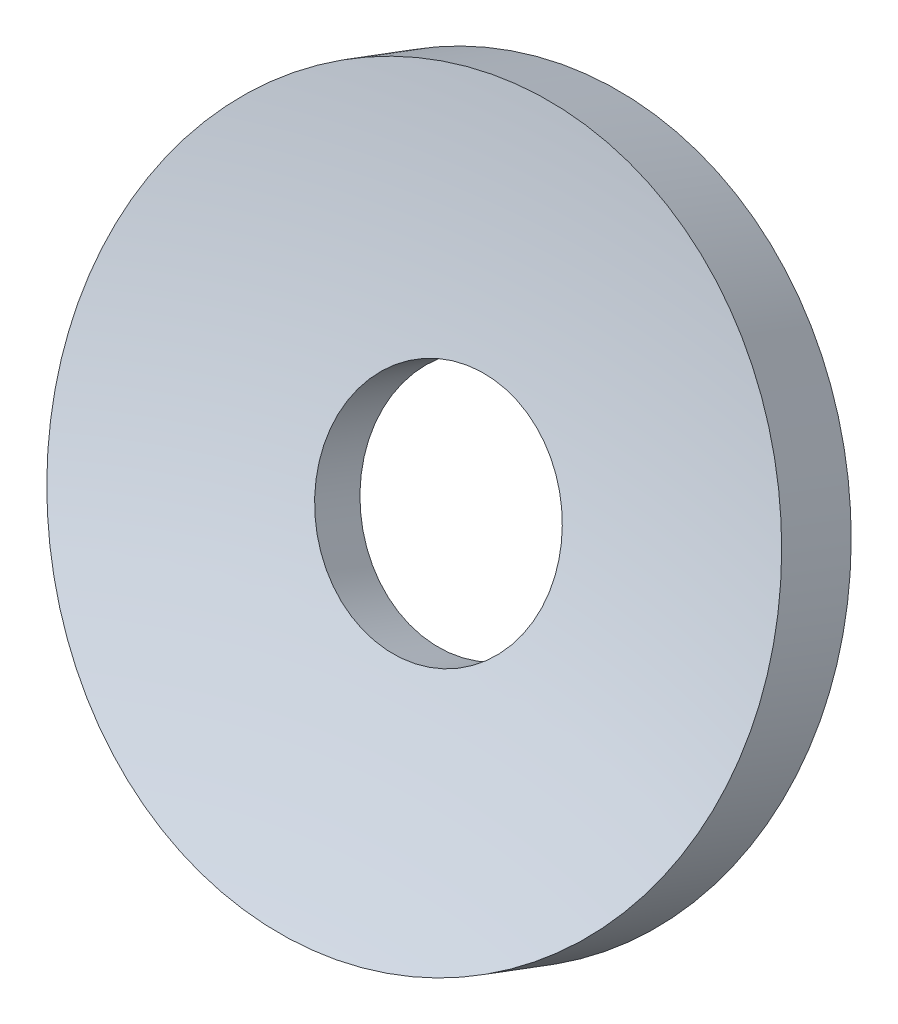
ISO-10303-21;
HEADER;
FILE_DESCRIPTION(('STEP AP214'),'2;1');
FILE_NAME('part.step','',(''),(''),'','','');
FILE_SCHEMA(('AUTOMOTIVE_DESIGN { 1 0 10303 214 1 1 1 1 }'));
ENDSEC;
DATA;
#1=APPLICATION_CONTEXT('core data for automotive mechanical design processes');
#2=APPLICATION_PROTOCOL_DEFINITION('international standard','automotive_design',2000,#1);
#3=PRODUCT_CONTEXT('',#1,'mechanical');
#4=PRODUCT('Part','Part','',(#3));
#5=PRODUCT_RELATED_PRODUCT_CATEGORY('part','',(#4));
#6=PRODUCT_DEFINITION_FORMATION('','',#4);
#7=PRODUCT_DEFINITION_CONTEXT('part definition',#1,'design');
#8=PRODUCT_DEFINITION('design','',#6,#7);
#9=PRODUCT_DEFINITION_SHAPE('','',#8);
#10=(LENGTH_UNIT() NAMED_UNIT(*) SI_UNIT(.MILLI.,.METRE.));
#11=(NAMED_UNIT(*) PLANE_ANGLE_UNIT() SI_UNIT($,.RADIAN.));
#12=(NAMED_UNIT(*) SI_UNIT($,.STERADIAN.) SOLID_ANGLE_UNIT());
#13=UNCERTAINTY_MEASURE_WITH_UNIT(LENGTH_MEASURE(1.E-05),#10,'distance_accuracy_value','');
#14=(GEOMETRIC_REPRESENTATION_CONTEXT(3) GLOBAL_UNCERTAINTY_ASSIGNED_CONTEXT((#13)) GLOBAL_UNIT_ASSIGNED_CONTEXT((#10,
#11,#12)) REPRESENTATION_CONTEXT('',''));
#15=CARTESIAN_POINT('',(0.,0.,0.));
#16=DIRECTION('',(0.,0.,1.));
#17=DIRECTION('',(1.,0.,0.));
#18=AXIS2_PLACEMENT_3D('',#15,#16,#17);
#19=CARTESIAN_POINT('',(5.89736030349278,148.184557063793,360.58752122222));
#20=DIRECTION('',(-0.0620196065672518,-0.383020208529755,-0.921655623461967));
#21=DIRECTION('',(0.,0.923433296037534,-0.383758970930004));
#22=AXIS2_PLACEMENT_3D('',#19,#20,#21);
#23=CYLINDRICAL_SURFACE('',#22,44.5);
#24=CARTESIAN_POINT('',(5.63022017939298,146.534755143034,356.617628292282));
#25=DIRECTION('',(-0.0620196065672518,-0.383020208529755,-0.921655623461967));
#26=DIRECTION('',(0.,0.923433296037534,-0.383758970930004));
#27=AXIS2_PLACEMENT_3D('',#24,#25,#26);
#28=CIRCLE('',#27,44.5);
#29=CARTESIAN_POINT('',(50.0445546202757,145.475629315512,354.069070140127));
#30=VERTEX_POINT('',#29);
#31=EDGE_CURVE('E44',#30,#30,#28,.T.);
#32=ORIENTED_EDGE('',*,*,#31,.T.);
#33=EDGE_LOOP('',(#32));
#34=FACE_BOUND('',#33,.T.);
#35=CARTESIAN_POINT('',(4.94800450715321,142.321532849207,346.4794164342));
#36=DIRECTION('',(-0.0620196065672518,-0.383020208529755,-0.921655623461967));
#37=DIRECTION('',(0.,0.923433296037534,-0.383758970930004));
#38=AXIS2_PLACEMENT_3D('',#35,#36,#37);
#39=CIRCLE('',#38,44.5);
#40=CARTESIAN_POINT('',(4.94800450715321,183.414314522877,329.402142227815));
#41=VERTEX_POINT('',#40);
#42=EDGE_CURVE('E10',#41,#41,#39,.T.);
#43=ORIENTED_EDGE('',*,*,#42,.F.);
#44=EDGE_LOOP('',(#43));
#45=FACE_BOUND('',#44,.T.);
#46=ADVANCED_FACE('F30',(#34,#45),#23,.T.);
#47=CARTESIAN_POINT('',(19.91912847599,141.964524143301,345.62035188853));
#48=DIRECTION('',(-0.0620196065672518,-0.383020208529755,-0.921655623461967));
#49=DIRECTION('',(0.,0.923433296037534,-0.383758970930004));
#50=AXIS2_PLACEMENT_3D('',#47,#48,#49);
#51=PLANE('',#50);
#52=ORIENTED_EDGE('',*,*,#42,.T.);
#53=EDGE_LOOP('',(#52));
#54=FACE_BOUND('',#53,.T.);
#55=CARTESIAN_POINT('',(4.94800450715321,142.321532849206,346.4794164342));
#56=DIRECTION('',(-0.0620196065672518,-0.383020208529755,-0.921655623461967));
#57=DIRECTION('',(0.,0.923433296037534,-0.383758970930004));
#58=AXIS2_PLACEMENT_3D('',#55,#56,#57);
#59=CIRCLE('',#58,15.);
#60=CARTESIAN_POINT('',(4.94800450715321,156.17303228977,340.72303187025));
#61=VERTEX_POINT('',#60);
#62=EDGE_CURVE('E36',#61,#61,#59,.T.);
#63=ORIENTED_EDGE('',*,*,#62,.F.);
#64=EDGE_LOOP('',(#63));
#65=FACE_BOUND('',#64,.T.);
#66=ADVANCED_FACE('F60',(#54,#65),#51,.T.);
#67=CARTESIAN_POINT('',(5.89736030349278,148.184557063793,360.58752122222));
#68=DIRECTION('',(-0.0620196065672518,-0.383020208529755,-0.921655623461967));
#69=DIRECTION('',(0.,0.923433296037534,-0.383758970930004));
#70=AXIS2_PLACEMENT_3D('',#67,#68,#69);
#71=CYLINDRICAL_SURFACE('',#70,15.);
#72=ORIENTED_EDGE('',*,*,#62,.T.);
#73=EDGE_LOOP('',(#72));
#74=FACE_BOUND('',#73,.T.);
#75=CARTESIAN_POINT('',(5.39276228280706,145.068264494327,353.088834450506));
#76=DIRECTION('',(-0.0620196065672518,-0.383020208529755,-0.921655623461967));
#77=DIRECTION('',(0.,0.923433296037534,-0.383758970930004));
#78=AXIS2_PLACEMENT_3D('',#75,#76,#77);
#79=CIRCLE('',#78,15.);
#80=CARTESIAN_POINT('',(20.3638862516454,144.71125578842,352.229769904836));
#81=VERTEX_POINT('',#80);
#82=EDGE_CURVE('E40',#81,#81,#79,.T.);
#83=ORIENTED_EDGE('',*,*,#82,.F.);
#84=EDGE_LOOP('',(#83));
#85=FACE_BOUND('',#84,.T.);
#86=ADVANCED_FACE('F54',(#74,#85),#71,.F.);
#87=CARTESIAN_POINT('',(19.7275884019823,233.597173226609,566.11458284446));
#88=DIRECTION('',(-0.0620196065672518,-0.383020208529755,-0.921655623461967));
#89=DIRECTION('',(0.998074931255787,-0.0238005803937322,-0.0572709697113485));
#90=AXIS2_PLACEMENT_3D('',#87,#88,#89);
#91=SPHERICAL_SURFACE('',#90,231.62);
#92=CARTESIAN_POINT('',(20.3638862516454,144.71125578842,352.229769904836));
#93=CARTESIAN_POINT('',(20.6739674685701,144.711582690888,352.230556525205));
#94=CARTESIAN_POINT('',(20.9840469748292,144.712148556675,352.231918159324));
#95=CARTESIAN_POINT('',(21.6041975644302,144.713758199679,352.235791418473));
#96=CARTESIAN_POINT('',(21.914268647772,144.714801976897,352.238303043502));
#97=CARTESIAN_POINT('',(22.5343973899518,144.717367427556,352.244476247876));
#98=CARTESIAN_POINT('',(22.8444550487898,144.718889100997,352.248137827221));
#99=CARTESIAN_POINT('',(23.4645519406289,144.722410319122,352.256610880114));
#100=CARTESIAN_POINT('',(23.7745911736298,144.724409863805,352.261422353661));
#101=CARTESIAN_POINT('',(24.3946462127488,144.728886792277,352.272195117631));
#102=CARTESIAN_POINT('',(24.7046620188668,144.731364176065,352.278156408052));
#103=CARTESIAN_POINT('',(25.3246652035543,144.736796742756,352.291228709535));
#104=CARTESIAN_POINT('',(25.6346525821239,144.739751925657,352.298339720597));
#105=CARTESIAN_POINT('',(26.2545939115071,144.746140042914,352.313711348678));
#106=CARTESIAN_POINT('',(26.5645478623208,144.749572977269,352.321971965697));
#107=CARTESIAN_POINT('',(27.1844173365239,144.756916542056,352.339642672441));
#108=CARTESIAN_POINT('',(27.4943328599134,144.760827172488,352.349052762166));
#109=CARTESIAN_POINT('',(28.1141204802199,144.769126066348,352.369022262534));
#110=CARTESIAN_POINT('',(28.4239925771369,144.773514329777,352.379581673177));
#111=CARTESIAN_POINT('',(29.0436883461505,144.782768418848,352.401849645055));
#112=CARTESIAN_POINT('',(29.3535120182471,144.78763424449,352.41355820629));
#113=CARTESIAN_POINT('',(29.9731059400531,144.797843379499,352.438124290487));
#114=CARTESIAN_POINT('',(30.2828761897626,144.803186688867,352.450981813449));
#115=CARTESIAN_POINT('',(30.9023582700893,144.814350705137,352.477845613706));
#116=CARTESIAN_POINT('',(31.2120701007066,144.82017141204,352.491851891));
#117=CARTESIAN_POINT('',(31.8314303470862,144.832290129493,352.521012973994));
#118=CARTESIAN_POINT('',(32.1410787628485,144.838588140042,352.536167779693));
#119=CARTESIAN_POINT('',(32.7603071847784,144.851661363197,352.567625675045));
#120=CARTESIAN_POINT('',(33.069887190946,144.858436575803,352.583928764697));
#121=CARTESIAN_POINT('',(33.6889738000501,144.872464093784,352.61768296498));
#122=CARTESIAN_POINT('',(33.9984804029866,144.87971639916,352.63513407561));
#123=CARTESIAN_POINT('',(34.6174152131762,144.8946979857,352.671184036357));
#124=CARTESIAN_POINT('',(34.9268434204292,144.902427266863,352.689782886472));
#125=CARTESIAN_POINT('',(35.5456164480641,144.918362680303,352.728128026184));
#126=CARTESIAN_POINT('',(35.854961268446,144.926568812578,352.747874315779));
#127=CARTESIAN_POINT('',(36.4735625324958,144.943457795873,352.788514015935));
#128=CARTESIAN_POINT('',(36.7828189761637,144.952140646892,352.809407426495));
#129=CARTESIAN_POINT('',(37.4012384983684,144.969982927617,352.852341031561));
#130=CARTESIAN_POINT('',(37.7104015769053,144.979142357323,352.874381226068));
#131=CARTESIAN_POINT('',(38.3286293819367,144.997937647675,352.919608043511));
#132=CARTESIAN_POINT('',(38.6376941084312,145.007573508323,352.942794666448));
#133=CARTESIAN_POINT('',(39.2557202240534,145.027321505128,352.990313966743));
#134=CARTESIAN_POINT('',(39.564681613181,145.037433641287,353.014646644102));
#135=CARTESIAN_POINT('',(40.1824960704114,145.058134026004,353.064457660746));
#136=CARTESIAN_POINT('',(40.4913491385143,145.068722274562,353.089936000031));
#137=CARTESIAN_POINT('',(41.1089419717845,145.090374713285,353.142037929554));
#138=CARTESIAN_POINT('',(41.4176817369519,145.10143890345,353.168661519792));
#139=CARTESIAN_POINT('',(42.0350429842684,145.124043046918,353.223053521771));
#140=CARTESIAN_POINT('',(42.3436644664175,145.13558300022,353.250821933513));
#141=CARTESIAN_POINT('',(42.9607841695223,145.15913848382,353.307503130586));
#142=CARTESIAN_POINT('',(43.269282390478,145.171154014117,353.336415915918));
#143=CARTESIAN_POINT('',(43.8861505950094,145.195660457889,353.395385393797));
#144=CARTESIAN_POINT('',(44.1945205785852,145.208151371365,353.425442086344));
#145=CARTESIAN_POINT('',(44.8111273342377,145.233608380014,353.486698893832));
#146=CARTESIAN_POINT('',(45.1193641063144,145.246574475188,353.517899008774));
#147=CARTESIAN_POINT('',(45.7356994670022,145.272981638077,353.581442157764));
#148=CARTESIAN_POINT('',(46.0437980556133,145.286422705793,353.613785191812));
#149=CARTESIAN_POINT('',(46.6598520796188,145.313779596989,353.679613657384));
#150=CARTESIAN_POINT('',(46.9678075150133,145.327695420468,353.713099088909));
#151=CARTESIAN_POINT('',(47.5835702651928,145.356001598608,353.781211809022));
#152=CARTESIAN_POINT('',(47.8913775799779,145.370391953268,353.815839097611));
#153=CARTESIAN_POINT('',(48.5068391237522,145.399646962081,353.886234974346));
#154=CARTESIAN_POINT('',(48.8144933527413,145.414511616233,353.922003562492));
#155=CARTESIAN_POINT('',(49.4296437628896,145.444714982642,353.994681457491));
#156=CARTESIAN_POINT('',(49.7371399440487,145.460053694898,354.031590764344));
#157=CARTESIAN_POINT('',(50.0445546202757,145.475629315512,354.069070140127));
#158=B_SPLINE_CURVE_WITH_KNOTS('',3,(#92,#93,#94,#95,#96,#97,#98,#99,#100,#101,#102,#103,#104,
#105,#106,#107,#108,#109,#110,#111,#112,#113,#114,#115,#116,#117,#118,#119,#120,#121,#122,#123,
#124,#125,#126,#127,#128,#129,#130,#131,#132,#133,#134,#135,#136,#137,#138,#139,#140,#141,#142,
#143,#144,#145,#146,#147,#148,#149,#150,#151,#152,#153,#154,#155,#156,#157),.UNSPECIFIED.,.F.,
.F.,(4,2,2,2,2,2,2,2,2,2,2,2,2,2,2,2,2,2,2,2,2,2,2,2,2,2,2,2,2,2,2,2,4),(0.,0.930246535733512,
1.86049307146703,2.79073960720055,3.72098614293406,4.65123267866758,5.5814792144011,
6.51172575013462,7.44197228586813,8.37221882160165,9.30246535733516,10.2327118930687,
11.1629584288022,12.0932049645357,13.0234515002692,13.9536980360028,14.8839445717363,
15.8141911074698,16.7444376432033,17.6746841789368,18.6049307146703,19.5351772504038,
20.4654237861374,21.3956703218709,22.3259168576044,23.2561633933379,24.1864099290714,
25.116656464805,26.0469030005385,26.977149536272,27.9073960720055,28.837642607739,
29.7678891434725),.UNSPECIFIED.);
#159=EDGE_CURVE('BSEAM52',#81,#30,#158,.T.);
#160=ORIENTED_EDGE('',*,*,#82,.T.);
#161=ORIENTED_EDGE('',*,*,#31,.F.);
#162=ORIENTED_EDGE('',*,*,#159,.T.);
#163=ORIENTED_EDGE('',*,*,#159,.F.);
#164=EDGE_LOOP('',(#160,#162,#161,#163));
#165=FACE_BOUND('',#164,.T.);
#166=ADVANCED_FACE('F52',(#165),#91,.F.);
#167=CLOSED_SHELL('',(#46,#66,#86,#166));
#168=MANIFOLD_SOLID_BREP('B2',#167);
#169=ADVANCED_BREP_SHAPE_REPRESENTATION('',(#18,#168),#14);
#170=SHAPE_DEFINITION_REPRESENTATION(#9,#169);
ENDSEC;
END-ISO-10303-21;
